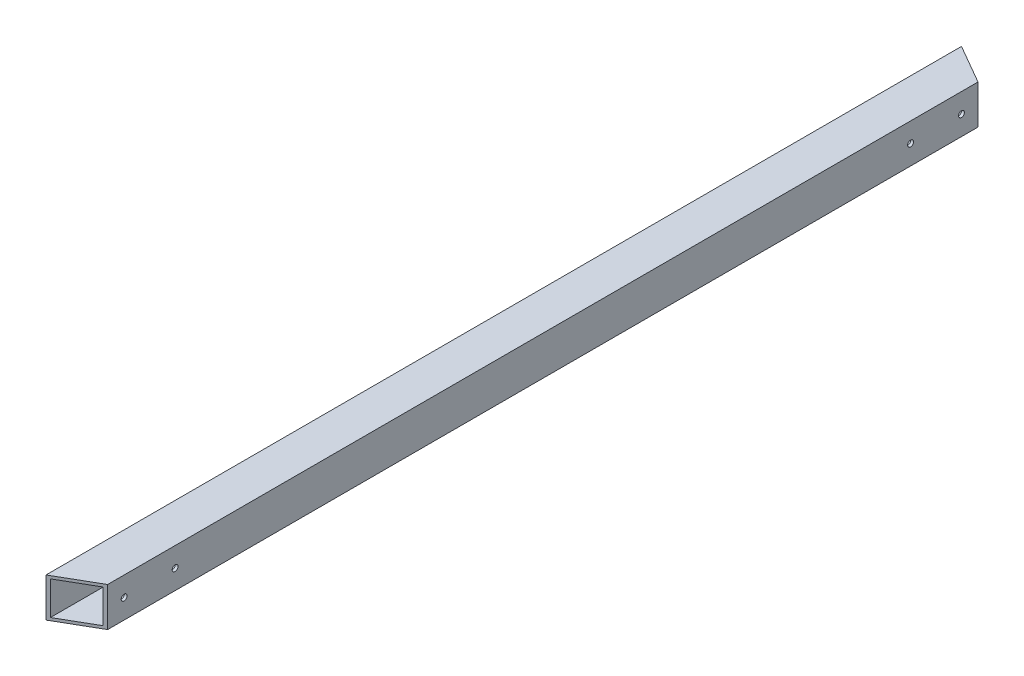
ISO-10303-21;
HEADER;
FILE_DESCRIPTION(('STEP AP214'),'2;1');
FILE_NAME('part.step','',(''),(''),'','','');
FILE_SCHEMA(('AUTOMOTIVE_DESIGN { 1 0 10303 214 1 1 1 1 }'));
ENDSEC;
DATA;
#1=APPLICATION_CONTEXT('core data for automotive mechanical design processes');
#2=APPLICATION_PROTOCOL_DEFINITION('international standard','automotive_design',2000,#1);
#3=PRODUCT_CONTEXT('',#1,'mechanical');
#4=PRODUCT('Part','Part','',(#3));
#5=PRODUCT_RELATED_PRODUCT_CATEGORY('part','',(#4));
#6=PRODUCT_DEFINITION_FORMATION('','',#4);
#7=PRODUCT_DEFINITION_CONTEXT('part definition',#1,'design');
#8=PRODUCT_DEFINITION('design','',#6,#7);
#9=PRODUCT_DEFINITION_SHAPE('','',#8);
#10=(LENGTH_UNIT() NAMED_UNIT(*) SI_UNIT(.MILLI.,.METRE.));
#11=(NAMED_UNIT(*) PLANE_ANGLE_UNIT() SI_UNIT($,.RADIAN.));
#12=(NAMED_UNIT(*) SI_UNIT($,.STERADIAN.) SOLID_ANGLE_UNIT());
#13=UNCERTAINTY_MEASURE_WITH_UNIT(LENGTH_MEASURE(1.E-05),#10,'distance_accuracy_value','');
#14=(GEOMETRIC_REPRESENTATION_CONTEXT(3) GLOBAL_UNCERTAINTY_ASSIGNED_CONTEXT((#13)) GLOBAL_UNIT_ASSIGNED_CONTEXT((#10,
#11,#12)) REPRESENTATION_CONTEXT('',''));
#15=CARTESIAN_POINT('',(0.,0.,0.));
#16=DIRECTION('',(0.,0.,1.));
#17=DIRECTION('',(1.,0.,0.));
#18=AXIS2_PLACEMENT_3D('',#15,#16,#17);
#19=CARTESIAN_POINT('',(-19.05,-19.05,1041.4));
#20=DIRECTION('',(0.,1.,0.));
#21=DIRECTION('',(0.,0.,1.));
#22=AXIS2_PLACEMENT_3D('',#19,#20,#21);
#23=PLANE('',#22);
#24=DIRECTION('',(-0.866025403784437,0.,0.500000000000004));
#25=VECTOR('',#24,1.);
#26=CARTESIAN_POINT('',(-19.84375,-19.05,1040.02518467149));
#27=LINE('',#26,#25);
#28=CARTESIAN_POINT('',(19.05,-19.05,1017.5698676392));
#29=VERTEX_POINT('',#28);
#30=CARTESIAN_POINT('',(-19.05,-19.05,1039.56691289532));
#31=VERTEX_POINT('',#30);
#32=EDGE_CURVE('E11',#29,#31,#27,.T.);
#33=ORIENTED_EDGE('',*,*,#32,.F.);
#34=DIRECTION('',(0.,0.,-1.));
#35=VECTOR('',#34,1.);
#36=CARTESIAN_POINT('',(19.05,-19.05,1041.4));
#37=LINE('',#36,#35);
#38=CARTESIAN_POINT('',(19.05,-19.05,23.830132360802));
#39=VERTEX_POINT('',#38);
#40=EDGE_CURVE('E147',#29,#39,#37,.T.);
#41=ORIENTED_EDGE('',*,*,#40,.T.);
#42=DIRECTION('',(0.866025403784437,0.,0.500000000000004));
#43=VECTOR('',#42,1.);
#44=CARTESIAN_POINT('',(431.095677750559,-19.05,261.724815328512));
#45=LINE('',#44,#43);
#46=CARTESIAN_POINT('',(-19.05,-19.05,1.83308710467711));
#47=VERTEX_POINT('',#46);
#48=EDGE_CURVE('E40',#47,#39,#45,.T.);
#49=ORIENTED_EDGE('',*,*,#48,.F.);
#50=DIRECTION('',(0.,0.,-1.));
#51=VECTOR('',#50,1.);
#52=CARTESIAN_POINT('',(-19.05,-19.05,1041.4));
#53=LINE('',#52,#51);
#54=EDGE_CURVE('E152',#31,#47,#53,.T.);
#55=ORIENTED_EDGE('',*,*,#54,.F.);
#56=EDGE_LOOP('',(#33,#41,#49,#55));
#57=FACE_BOUND('',#56,.T.);
#58=ADVANCED_FACE('F32',(#57),#23,.T.);
#59=CARTESIAN_POINT('',(-19.05,19.05,1041.4));
#60=DIRECTION('',(1.,0.,0.));
#61=DIRECTION('',(0.,0.,-1.));
#62=AXIS2_PLACEMENT_3D('',#59,#60,#61);
#63=PLANE('',#62);
#64=CARTESIAN_POINT('',(-19.05,0.,996.95));
#65=DIRECTION('',(1.,0.,0.));
#66=DIRECTION('',(0.,0.,-1.));
#67=AXIS2_PLACEMENT_3D('',#64,#65,#66);
#68=CIRCLE('',#67,3.37343750000026);
#69=CARTESIAN_POINT('',(-19.05,0.,993.5765625));
#70=VERTEX_POINT('',#69);
#71=EDGE_CURVE('E386',#70,#70,#68,.T.);
#72=ORIENTED_EDGE('',*,*,#71,.F.);
#73=EDGE_LOOP('',(#72));
#74=FACE_BOUND('',#73,.T.);
#75=CARTESIAN_POINT('',(-19.05,0.,44.45));
#76=DIRECTION('',(1.,0.,0.));
#77=DIRECTION('',(0.,0.,-1.));
#78=AXIS2_PLACEMENT_3D('',#75,#76,#77);
#79=CIRCLE('',#78,3.3734375);
#80=CARTESIAN_POINT('',(-19.05,0.,41.0765625));
#81=VERTEX_POINT('',#80);
#82=EDGE_CURVE('E382',#81,#81,#79,.T.);
#83=ORIENTED_EDGE('',*,*,#82,.F.);
#84=EDGE_LOOP('',(#83));
#85=FACE_BOUND('',#84,.T.);
#86=CARTESIAN_POINT('',(-19.05,0.,102.389658314));
#87=DIRECTION('',(1.,0.,0.));
#88=DIRECTION('',(0.,0.,-1.));
#89=AXIS2_PLACEMENT_3D('',#86,#87,#88);
#90=CIRCLE('',#89,3.37343749999996);
#91=CARTESIAN_POINT('',(-19.05,0.,99.016220814));
#92=VERTEX_POINT('',#91);
#93=EDGE_CURVE('E376',#92,#92,#90,.T.);
#94=ORIENTED_EDGE('',*,*,#93,.F.);
#95=EDGE_LOOP('',(#94));
#96=FACE_BOUND('',#95,.T.);
#97=CARTESIAN_POINT('',(-19.05,-1.22124532708767E-12,939.010341686));
#98=DIRECTION('',(1.,0.,0.));
#99=DIRECTION('',(0.,0.,-1.));
#100=AXIS2_PLACEMENT_3D('',#97,#98,#99);
#101=CIRCLE('',#100,3.37343749999992);
#102=CARTESIAN_POINT('',(-19.05,-1.22124532708767E-12,935.636904186));
#103=VERTEX_POINT('',#102);
#104=EDGE_CURVE('E348',#103,#103,#101,.T.);
#105=ORIENTED_EDGE('',*,*,#104,.F.);
#106=EDGE_LOOP('',(#105));
#107=FACE_BOUND('',#106,.T.);
#108=DIRECTION('',(0.,1.,0.));
#109=VECTOR('',#108,1.);
#110=CARTESIAN_POINT('',(-19.05,19.05,1039.56691289532));
#111=LINE('',#110,#109);
#112=CARTESIAN_POINT('',(-19.05,19.05,1039.56691289532));
#113=VERTEX_POINT('',#112);
#114=EDGE_CURVE('E168',#31,#113,#111,.T.);
#115=ORIENTED_EDGE('',*,*,#114,.F.);
#116=ORIENTED_EDGE('',*,*,#54,.T.);
#117=DIRECTION('',(0.,-1.,0.));
#118=VECTOR('',#117,1.);
#119=CARTESIAN_POINT('',(-19.05,19.05,1.833087104677));
#120=LINE('',#119,#118);
#121=CARTESIAN_POINT('',(-19.05,19.05,1.833087104677));
#122=VERTEX_POINT('',#121);
#123=EDGE_CURVE('E138',#122,#47,#120,.T.);
#124=ORIENTED_EDGE('',*,*,#123,.F.);
#125=DIRECTION('',(0.,0.,-1.));
#126=VECTOR('',#125,1.);
#127=CARTESIAN_POINT('',(-19.05,19.05,1041.4));
#128=LINE('',#127,#126);
#129=EDGE_CURVE('E155',#113,#122,#128,.T.);
#130=ORIENTED_EDGE('',*,*,#129,.F.);
#131=EDGE_LOOP('',(#115,#116,#124,#130));
#132=FACE_BOUND('',#131,.T.);
#133=ADVANCED_FACE('F167',(#74,#85,#96,#107,#132),#63,.T.);
#134=CARTESIAN_POINT('',(-19.05,19.05,1041.4));
#135=DIRECTION('',(0.,-1.,0.));
#136=DIRECTION('',(0.,0.,-1.));
#137=AXIS2_PLACEMENT_3D('',#134,#135,#136);
#138=PLANE('',#137);
#139=DIRECTION('',(0.866025403784437,0.,-0.500000000000004));
#140=VECTOR('',#139,1.);
#141=CARTESIAN_POINT('',(-19.84375,19.05,1040.02518467149));
#142=LINE('',#141,#140);
#143=CARTESIAN_POINT('',(19.05,19.05,1017.5698676392));
#144=VERTEX_POINT('',#143);
#145=EDGE_CURVE('E164',#113,#144,#142,.T.);
#146=ORIENTED_EDGE('',*,*,#145,.F.);
#147=ORIENTED_EDGE('',*,*,#129,.T.);
#148=DIRECTION('',(-0.866025403784437,0.,-0.500000000000004));
#149=VECTOR('',#148,1.);
#150=CARTESIAN_POINT('',(431.095677750559,19.05,261.724815328512));
#151=LINE('',#150,#149);
#152=CARTESIAN_POINT('',(19.05,19.05,23.830132360802));
#153=VERTEX_POINT('',#152);
#154=EDGE_CURVE('E150',#153,#122,#151,.T.);
#155=ORIENTED_EDGE('',*,*,#154,.F.);
#156=DIRECTION('',(0.,0.,-1.));
#157=VECTOR('',#156,1.);
#158=CARTESIAN_POINT('',(19.05,19.05,1041.4));
#159=LINE('',#158,#157);
#160=EDGE_CURVE('E125',#144,#153,#159,.T.);
#161=ORIENTED_EDGE('',*,*,#160,.F.);
#162=EDGE_LOOP('',(#146,#147,#155,#161));
#163=FACE_BOUND('',#162,.T.);
#164=ADVANCED_FACE('F163',(#163),#138,.T.);
#165=CARTESIAN_POINT('',(19.05,19.05,1041.4));
#166=DIRECTION('',(-1.,0.,0.));
#167=DIRECTION('',(0.,0.,1.));
#168=AXIS2_PLACEMENT_3D('',#165,#166,#167);
#169=PLANE('',#168);
#170=CARTESIAN_POINT('',(19.05,0.,996.95));
#171=DIRECTION('',(-1.,0.,0.));
#172=DIRECTION('',(0.,0.,1.));
#173=AXIS2_PLACEMENT_3D('',#170,#171,#172);
#174=CIRCLE('',#173,3.37343750000026);
#175=CARTESIAN_POINT('',(19.05,0.,1000.3234375));
#176=VERTEX_POINT('',#175);
#177=EDGE_CURVE('E340',#176,#176,#174,.T.);
#178=ORIENTED_EDGE('',*,*,#177,.F.);
#179=EDGE_LOOP('',(#178));
#180=FACE_BOUND('',#179,.T.);
#181=CARTESIAN_POINT('',(19.05,0.,44.45));
#182=DIRECTION('',(-1.,0.,0.));
#183=DIRECTION('',(0.,0.,1.));
#184=AXIS2_PLACEMENT_3D('',#181,#182,#183);
#185=CIRCLE('',#184,3.3734375);
#186=CARTESIAN_POINT('',(19.05,0.,47.8234375));
#187=VERTEX_POINT('',#186);
#188=EDGE_CURVE('E379',#187,#187,#185,.T.);
#189=ORIENTED_EDGE('',*,*,#188,.F.);
#190=EDGE_LOOP('',(#189));
#191=FACE_BOUND('',#190,.T.);
#192=CARTESIAN_POINT('',(19.05,0.,102.389658314));
#193=DIRECTION('',(-1.,0.,0.));
#194=DIRECTION('',(0.,0.,1.));
#195=AXIS2_PLACEMENT_3D('',#192,#193,#194);
#196=CIRCLE('',#195,3.37343749999996);
#197=CARTESIAN_POINT('',(19.05,0.,105.763095814));
#198=VERTEX_POINT('',#197);
#199=EDGE_CURVE('E373',#198,#198,#196,.T.);
#200=ORIENTED_EDGE('',*,*,#199,.F.);
#201=EDGE_LOOP('',(#200));
#202=FACE_BOUND('',#201,.T.);
#203=CARTESIAN_POINT('',(19.05,-1.22124532708767E-12,939.010341686));
#204=DIRECTION('',(-1.,0.,0.));
#205=DIRECTION('',(0.,0.,1.));
#206=AXIS2_PLACEMENT_3D('',#203,#204,#205);
#207=CIRCLE('',#206,3.37343749999992);
#208=CARTESIAN_POINT('',(19.05,-1.22124532708767E-12,942.383779186));
#209=VERTEX_POINT('',#208);
#210=EDGE_CURVE('E344',#209,#209,#207,.T.);
#211=ORIENTED_EDGE('',*,*,#210,.F.);
#212=EDGE_LOOP('',(#211));
#213=FACE_BOUND('',#212,.T.);
#214=DIRECTION('',(0.,-1.,0.));
#215=VECTOR('',#214,1.);
#216=CARTESIAN_POINT('',(19.05,19.05,1017.5698676392));
#217=LINE('',#216,#215);
#218=EDGE_CURVE('E54',#144,#29,#217,.T.);
#219=ORIENTED_EDGE('',*,*,#218,.F.);
#220=ORIENTED_EDGE('',*,*,#160,.T.);
#221=DIRECTION('',(0.,1.,0.));
#222=VECTOR('',#221,1.);
#223=CARTESIAN_POINT('',(19.05,19.05,23.8301323608021));
#224=LINE('',#223,#222);
#225=EDGE_CURVE('E135',#39,#153,#224,.T.);
#226=ORIENTED_EDGE('',*,*,#225,.F.);
#227=ORIENTED_EDGE('',*,*,#40,.F.);
#228=EDGE_LOOP('',(#219,#220,#226,#227));
#229=FACE_BOUND('',#228,.T.);
#230=ADVANCED_FACE('F146',(#180,#191,#202,#213,#229),#169,.T.);
#231=CARTESIAN_POINT('',(-22.225,-1019.175,0.));
#232=DIRECTION('',(-0.500000000000004,0.,0.866025403784436));
#233=DIRECTION('',(0.866025403784437,0.,0.500000000000004));
#234=AXIS2_PLACEMENT_3D('',#231,#232,#233);
#235=PLANE('',#234);
#236=ORIENTED_EDGE('',*,*,#225,.T.);
#237=ORIENTED_EDGE('',*,*,#154,.T.);
#238=ORIENTED_EDGE('',*,*,#123,.T.);
#239=ORIENTED_EDGE('',*,*,#48,.T.);
#240=EDGE_LOOP('',(#236,#237,#238,#239));
#241=FACE_BOUND('',#240,.T.);
#242=DIRECTION('',(0.,-1.,0.));
#243=VECTOR('',#242,1.);
#244=CARTESIAN_POINT('',(-22.225,22.225,0.));
#245=LINE('',#244,#243);
#246=CARTESIAN_POINT('',(-22.225,22.225,0.));
#247=VERTEX_POINT('',#246);
#248=CARTESIAN_POINT('',(-22.225,-22.2250000000001,0.));
#249=VERTEX_POINT('',#248);
#250=EDGE_CURVE('E121',#247,#249,#245,.T.);
#251=ORIENTED_EDGE('',*,*,#250,.F.);
#252=DIRECTION('',(0.866025403784437,0.,0.500000000000004));
#253=VECTOR('',#252,1.);
#254=CARTESIAN_POINT('',(-22.225,22.225,0.));
#255=LINE('',#254,#253);
#256=CARTESIAN_POINT('',(22.225,22.225,25.6632194654791));
#257=VERTEX_POINT('',#256);
#258=EDGE_CURVE('E111',#247,#257,#255,.T.);
#259=ORIENTED_EDGE('',*,*,#258,.T.);
#260=DIRECTION('',(0.,1.,0.));
#261=VECTOR('',#260,1.);
#262=CARTESIAN_POINT('',(22.225,-1019.175,25.6632194654791));
#263=LINE('',#262,#261);
#264=CARTESIAN_POINT('',(22.225,-22.225,25.6632194654792));
#265=VERTEX_POINT('',#264);
#266=EDGE_CURVE('E47',#265,#257,#263,.T.);
#267=ORIENTED_EDGE('',*,*,#266,.F.);
#268=DIRECTION('',(0.866025403784437,0.,0.500000000000004));
#269=VECTOR('',#268,1.);
#270=CARTESIAN_POINT('',(428.714427750559,-22.225,260.350000000004));
#271=LINE('',#270,#269);
#272=EDGE_CURVE('E149',#249,#265,#271,.T.);
#273=ORIENTED_EDGE('',*,*,#272,.F.);
#274=EDGE_LOOP('',(#251,#259,#267,#273));
#275=FACE_BOUND('',#274,.T.);
#276=ADVANCED_FACE('F134',(#241,#275),#235,.F.);
#277=CARTESIAN_POINT('',(22.225,-1019.175,1015.73678053452));
#278=DIRECTION('',(-0.500000000000004,0.,-0.866025403784436));
#279=DIRECTION('',(-0.866025403784437,0.,0.500000000000004));
#280=AXIS2_PLACEMENT_3D('',#277,#278,#279);
#281=PLANE('',#280);
#282=ORIENTED_EDGE('',*,*,#218,.T.);
#283=ORIENTED_EDGE('',*,*,#32,.T.);
#284=ORIENTED_EDGE('',*,*,#114,.T.);
#285=ORIENTED_EDGE('',*,*,#145,.T.);
#286=EDGE_LOOP('',(#282,#283,#284,#285));
#287=FACE_BOUND('',#286,.T.);
#288=DIRECTION('',(0.,1.,0.));
#289=VECTOR('',#288,1.);
#290=CARTESIAN_POINT('',(22.225,-1019.175,1015.73678053452));
#291=LINE('',#290,#289);
#292=CARTESIAN_POINT('',(22.225,-22.2250000000001,1015.73678053452));
#293=VERTEX_POINT('',#292);
#294=CARTESIAN_POINT('',(22.225,22.225,1015.73678053452));
#295=VERTEX_POINT('',#294);
#296=EDGE_CURVE('E102',#293,#295,#291,.T.);
#297=ORIENTED_EDGE('',*,*,#296,.T.);
#298=DIRECTION('',(-0.866025403784437,0.,0.500000000000004));
#299=VECTOR('',#298,1.);
#300=CARTESIAN_POINT('',(22.225,22.225,1015.73678053452));
#301=LINE('',#300,#299);
#302=CARTESIAN_POINT('',(-22.225,22.225,1041.4));
#303=VERTEX_POINT('',#302);
#304=EDGE_CURVE('E95',#295,#303,#301,.T.);
#305=ORIENTED_EDGE('',*,*,#304,.T.);
#306=DIRECTION('',(0.,-1.,0.));
#307=VECTOR('',#306,1.);
#308=CARTESIAN_POINT('',(-22.225,22.225,1041.4));
#309=LINE('',#308,#307);
#310=CARTESIAN_POINT('',(-22.225,-22.225,1041.4));
#311=VERTEX_POINT('',#310);
#312=EDGE_CURVE('E99',#303,#311,#309,.T.);
#313=ORIENTED_EDGE('',*,*,#312,.T.);
#314=DIRECTION('',(-0.866025403784437,0.,0.500000000000004));
#315=VECTOR('',#314,1.);
#316=CARTESIAN_POINT('',(-22.225,-22.225,1041.4));
#317=LINE('',#316,#315);
#318=EDGE_CURVE('E153',#293,#311,#317,.T.);
#319=ORIENTED_EDGE('',*,*,#318,.F.);
#320=EDGE_LOOP('',(#297,#305,#313,#319));
#321=FACE_BOUND('',#320,.T.);
#322=ADVANCED_FACE('F97',(#287,#321),#281,.F.);
#323=CARTESIAN_POINT('',(22.225,22.225,1041.4));
#324=DIRECTION('',(-1.,0.,0.));
#325=DIRECTION('',(0.,-1.,0.));
#326=AXIS2_PLACEMENT_3D('',#323,#324,#325);
#327=PLANE('',#326);
#328=CARTESIAN_POINT('',(22.225,0.,996.95));
#329=DIRECTION('',(-1.,0.,0.));
#330=DIRECTION('',(0.,0.,1.));
#331=AXIS2_PLACEMENT_3D('',#328,#329,#330);
#332=CIRCLE('',#331,3.37343750000026);
#333=CARTESIAN_POINT('',(22.225,0.,1000.3234375));
#334=VERTEX_POINT('',#333);
#335=EDGE_CURVE('E343',#334,#334,#332,.T.);
#336=ORIENTED_EDGE('',*,*,#335,.T.);
#337=EDGE_LOOP('',(#336));
#338=FACE_BOUND('',#337,.T.);
#339=CARTESIAN_POINT('',(22.225,0.,44.45));
#340=DIRECTION('',(-1.,0.,0.));
#341=DIRECTION('',(0.,0.,1.));
#342=AXIS2_PLACEMENT_3D('',#339,#340,#341);
#343=CIRCLE('',#342,3.3734375);
#344=CARTESIAN_POINT('',(22.225,0.,47.8234375));
#345=VERTEX_POINT('',#344);
#346=EDGE_CURVE('E351',#345,#345,#343,.T.);
#347=ORIENTED_EDGE('',*,*,#346,.T.);
#348=EDGE_LOOP('',(#347));
#349=FACE_BOUND('',#348,.T.);
#350=CARTESIAN_POINT('',(22.225,0.,102.389658314));
#351=DIRECTION('',(-1.,0.,0.));
#352=DIRECTION('',(0.,0.,1.));
#353=AXIS2_PLACEMENT_3D('',#350,#351,#352);
#354=CIRCLE('',#353,3.37343749999996);
#355=CARTESIAN_POINT('',(22.225,0.,105.763095814));
#356=VERTEX_POINT('',#355);
#357=EDGE_CURVE('E359',#356,#356,#354,.T.);
#358=ORIENTED_EDGE('',*,*,#357,.T.);
#359=EDGE_LOOP('',(#358));
#360=FACE_BOUND('',#359,.T.);
#361=CARTESIAN_POINT('',(22.225,-1.22124532708767E-12,939.010341686));
#362=DIRECTION('',(-1.,0.,0.));
#363=DIRECTION('',(0.,0.,1.));
#364=AXIS2_PLACEMENT_3D('',#361,#362,#363);
#365=CIRCLE('',#364,3.37343749999992);
#366=CARTESIAN_POINT('',(22.225,-1.22124532708767E-12,942.383779186));
#367=VERTEX_POINT('',#366);
#368=EDGE_CURVE('E365',#367,#367,#365,.T.);
#369=ORIENTED_EDGE('',*,*,#368,.T.);
#370=EDGE_LOOP('',(#369));
#371=FACE_BOUND('',#370,.T.);
#372=DIRECTION('',(0.,0.,-1.));
#373=VECTOR('',#372,1.);
#374=CARTESIAN_POINT('',(22.225,22.225,1041.4));
#375=LINE('',#374,#373);
#376=EDGE_CURVE('E114',#295,#257,#375,.T.);
#377=ORIENTED_EDGE('',*,*,#376,.F.);
#378=ORIENTED_EDGE('',*,*,#296,.F.);
#379=DIRECTION('',(0.,0.,-1.));
#380=VECTOR('',#379,1.);
#381=CARTESIAN_POINT('',(22.225,-22.225,1041.4));
#382=LINE('',#381,#380);
#383=EDGE_CURVE('E120',#293,#265,#382,.T.);
#384=ORIENTED_EDGE('',*,*,#383,.T.);
#385=ORIENTED_EDGE('',*,*,#266,.T.);
#386=EDGE_LOOP('',(#377,#378,#384,#385));
#387=FACE_BOUND('',#386,.T.);
#388=ADVANCED_FACE('F34',(#338,#349,#360,#371,#387),#327,.F.);
#389=CARTESIAN_POINT('',(-22.225,22.225,1041.4));
#390=DIRECTION('',(0.,-1.,0.));
#391=DIRECTION('',(0.,0.,-1.));
#392=AXIS2_PLACEMENT_3D('',#389,#390,#391);
#393=PLANE('',#392);
#394=DIRECTION('',(0.,0.,-1.));
#395=VECTOR('',#394,1.);
#396=CARTESIAN_POINT('',(-22.225,22.225,1041.4));
#397=LINE('',#396,#395);
#398=EDGE_CURVE('E109',#303,#247,#397,.T.);
#399=ORIENTED_EDGE('',*,*,#398,.F.);
#400=ORIENTED_EDGE('',*,*,#304,.F.);
#401=ORIENTED_EDGE('',*,*,#376,.T.);
#402=ORIENTED_EDGE('',*,*,#258,.F.);
#403=EDGE_LOOP('',(#399,#400,#401,#402));
#404=FACE_BOUND('',#403,.T.);
#405=ADVANCED_FACE('F110',(#404),#393,.F.);
#406=CARTESIAN_POINT('',(-22.225,22.225,1041.4));
#407=DIRECTION('',(1.,0.,0.));
#408=DIRECTION('',(0.,0.,-1.));
#409=AXIS2_PLACEMENT_3D('',#406,#407,#408);
#410=PLANE('',#409);
#411=CARTESIAN_POINT('',(-22.225,0.,996.95));
#412=DIRECTION('',(-1.,0.,0.));
#413=DIRECTION('',(0.,0.,1.));
#414=AXIS2_PLACEMENT_3D('',#411,#412,#413);
#415=CIRCLE('',#414,3.37343750000026);
#416=CARTESIAN_POINT('',(-22.225,0.,1000.3234375));
#417=VERTEX_POINT('',#416);
#418=EDGE_CURVE('E345',#417,#417,#415,.T.);
#419=ORIENTED_EDGE('',*,*,#418,.F.);
#420=EDGE_LOOP('',(#419));
#421=FACE_BOUND('',#420,.T.);
#422=CARTESIAN_POINT('',(-22.225,0.,44.45));
#423=DIRECTION('',(-1.,0.,0.));
#424=DIRECTION('',(0.,0.,1.));
#425=AXIS2_PLACEMENT_3D('',#422,#423,#424);
#426=CIRCLE('',#425,3.3734375);
#427=CARTESIAN_POINT('',(-22.225,0.,47.8234375));
#428=VERTEX_POINT('',#427);
#429=EDGE_CURVE('E356',#428,#428,#426,.T.);
#430=ORIENTED_EDGE('',*,*,#429,.F.);
#431=EDGE_LOOP('',(#430));
#432=FACE_BOUND('',#431,.T.);
#433=CARTESIAN_POINT('',(-22.225,0.,102.389658314));
#434=DIRECTION('',(-1.,0.,0.));
#435=DIRECTION('',(0.,0.,1.));
#436=AXIS2_PLACEMENT_3D('',#433,#434,#435);
#437=CIRCLE('',#436,3.37343749999996);
#438=CARTESIAN_POINT('',(-22.225,0.,105.763095814));
#439=VERTEX_POINT('',#438);
#440=EDGE_CURVE('E362',#439,#439,#437,.T.);
#441=ORIENTED_EDGE('',*,*,#440,.F.);
#442=EDGE_LOOP('',(#441));
#443=FACE_BOUND('',#442,.T.);
#444=CARTESIAN_POINT('',(-22.225,-1.22124532708767E-12,939.010341686));
#445=DIRECTION('',(-1.,0.,0.));
#446=DIRECTION('',(0.,0.,1.));
#447=AXIS2_PLACEMENT_3D('',#444,#445,#446);
#448=CIRCLE('',#447,3.37343749999992);
#449=CARTESIAN_POINT('',(-22.225,-1.22124532708767E-12,942.383779186));
#450=VERTEX_POINT('',#449);
#451=EDGE_CURVE('E368',#450,#450,#448,.T.);
#452=ORIENTED_EDGE('',*,*,#451,.F.);
#453=EDGE_LOOP('',(#452));
#454=FACE_BOUND('',#453,.T.);
#455=ORIENTED_EDGE('',*,*,#250,.T.);
#456=DIRECTION('',(0.,0.,-1.));
#457=VECTOR('',#456,1.);
#458=CARTESIAN_POINT('',(-22.225,-22.225,1041.4));
#459=LINE('',#458,#457);
#460=EDGE_CURVE('E115',#311,#249,#459,.T.);
#461=ORIENTED_EDGE('',*,*,#460,.F.);
#462=ORIENTED_EDGE('',*,*,#312,.F.);
#463=ORIENTED_EDGE('',*,*,#398,.T.);
#464=EDGE_LOOP('',(#455,#461,#462,#463));
#465=FACE_BOUND('',#464,.T.);
#466=ADVANCED_FACE('F118',(#421,#432,#443,#454,#465),#410,.F.);
#467=CARTESIAN_POINT('',(-22.225,-22.225,1041.4));
#468=DIRECTION('',(0.,1.,0.));
#469=DIRECTION('',(0.,0.,1.));
#470=AXIS2_PLACEMENT_3D('',#467,#468,#469);
#471=PLANE('',#470);
#472=ORIENTED_EDGE('',*,*,#383,.F.);
#473=ORIENTED_EDGE('',*,*,#318,.T.);
#474=ORIENTED_EDGE('',*,*,#460,.T.);
#475=ORIENTED_EDGE('',*,*,#272,.T.);
#476=EDGE_LOOP('',(#472,#473,#474,#475));
#477=FACE_BOUND('',#476,.T.);
#478=ADVANCED_FACE('F199',(#477),#471,.F.);
#479=CARTESIAN_POINT('',(22.225,-1.22124532708767E-12,939.010341686));
#480=DIRECTION('',(-1.,0.,0.));
#481=DIRECTION('',(0.,0.,1.));
#482=AXIS2_PLACEMENT_3D('',#479,#480,#481);
#483=CYLINDRICAL_SURFACE('',#482,3.37343749999992);
#484=ORIENTED_EDGE('',*,*,#104,.T.);
#485=EDGE_LOOP('',(#484));
#486=FACE_BOUND('',#485,.T.);
#487=ORIENTED_EDGE('',*,*,#451,.T.);
#488=EDGE_LOOP('',(#487));
#489=FACE_BOUND('',#488,.T.);
#490=ADVANCED_FACE('F202',(#486,#489),#483,.F.);
#491=CARTESIAN_POINT('',(22.225,0.,102.389658314));
#492=DIRECTION('',(-1.,0.,0.));
#493=DIRECTION('',(0.,0.,1.));
#494=AXIS2_PLACEMENT_3D('',#491,#492,#493);
#495=CYLINDRICAL_SURFACE('',#494,3.37343749999996);
#496=ORIENTED_EDGE('',*,*,#93,.T.);
#497=EDGE_LOOP('',(#496));
#498=FACE_BOUND('',#497,.T.);
#499=ORIENTED_EDGE('',*,*,#440,.T.);
#500=EDGE_LOOP('',(#499));
#501=FACE_BOUND('',#500,.T.);
#502=ADVANCED_FACE('F225',(#498,#501),#495,.F.);
#503=CARTESIAN_POINT('',(22.225,0.,44.45));
#504=DIRECTION('',(-1.,0.,0.));
#505=DIRECTION('',(0.,0.,1.));
#506=AXIS2_PLACEMENT_3D('',#503,#504,#505);
#507=CYLINDRICAL_SURFACE('',#506,3.3734375);
#508=ORIENTED_EDGE('',*,*,#82,.T.);
#509=EDGE_LOOP('',(#508));
#510=FACE_BOUND('',#509,.T.);
#511=ORIENTED_EDGE('',*,*,#429,.T.);
#512=EDGE_LOOP('',(#511));
#513=FACE_BOUND('',#512,.T.);
#514=ADVANCED_FACE('F233',(#510,#513),#507,.F.);
#515=CARTESIAN_POINT('',(22.225,0.,996.95));
#516=DIRECTION('',(-1.,0.,0.));
#517=DIRECTION('',(0.,0.,1.));
#518=AXIS2_PLACEMENT_3D('',#515,#516,#517);
#519=CYLINDRICAL_SURFACE('',#518,3.37343750000026);
#520=ORIENTED_EDGE('',*,*,#71,.T.);
#521=EDGE_LOOP('',(#520));
#522=FACE_BOUND('',#521,.T.);
#523=ORIENTED_EDGE('',*,*,#418,.T.);
#524=EDGE_LOOP('',(#523));
#525=FACE_BOUND('',#524,.T.);
#526=ADVANCED_FACE('F242',(#522,#525),#519,.F.);
#527=ORIENTED_EDGE('',*,*,#210,.T.);
#528=EDGE_LOOP('',(#527));
#529=FACE_BOUND('',#528,.T.);
#530=ORIENTED_EDGE('',*,*,#368,.F.);
#531=EDGE_LOOP('',(#530));
#532=FACE_BOUND('',#531,.T.);
#533=ADVANCED_FACE('F227',(#529,#532),#483,.F.);
#534=ORIENTED_EDGE('',*,*,#199,.T.);
#535=EDGE_LOOP('',(#534));
#536=FACE_BOUND('',#535,.T.);
#537=ORIENTED_EDGE('',*,*,#357,.F.);
#538=EDGE_LOOP('',(#537));
#539=FACE_BOUND('',#538,.T.);
#540=ADVANCED_FACE('F236',(#536,#539),#495,.F.);
#541=ORIENTED_EDGE('',*,*,#188,.T.);
#542=EDGE_LOOP('',(#541));
#543=FACE_BOUND('',#542,.T.);
#544=ORIENTED_EDGE('',*,*,#346,.F.);
#545=EDGE_LOOP('',(#544));
#546=FACE_BOUND('',#545,.T.);
#547=ADVANCED_FACE('F245',(#543,#546),#507,.F.);
#548=ORIENTED_EDGE('',*,*,#177,.T.);
#549=EDGE_LOOP('',(#548));
#550=FACE_BOUND('',#549,.T.);
#551=ORIENTED_EDGE('',*,*,#335,.F.);
#552=EDGE_LOOP('',(#551));
#553=FACE_BOUND('',#552,.T.);
#554=ADVANCED_FACE('F253',(#550,#553),#519,.F.);
#555=CLOSED_SHELL('',(#58,#133,#164,#230,#276,#322,#388,#405,#466,#478,#490,#502,#514,#526,#533,
#540,#547,#554));
#556=MANIFOLD_SOLID_BREP('B2',#555);
#557=ADVANCED_BREP_SHAPE_REPRESENTATION('',(#18,#556),#14);
#558=SHAPE_DEFINITION_REPRESENTATION(#9,#557);
ENDSEC;
END-ISO-10303-21;
